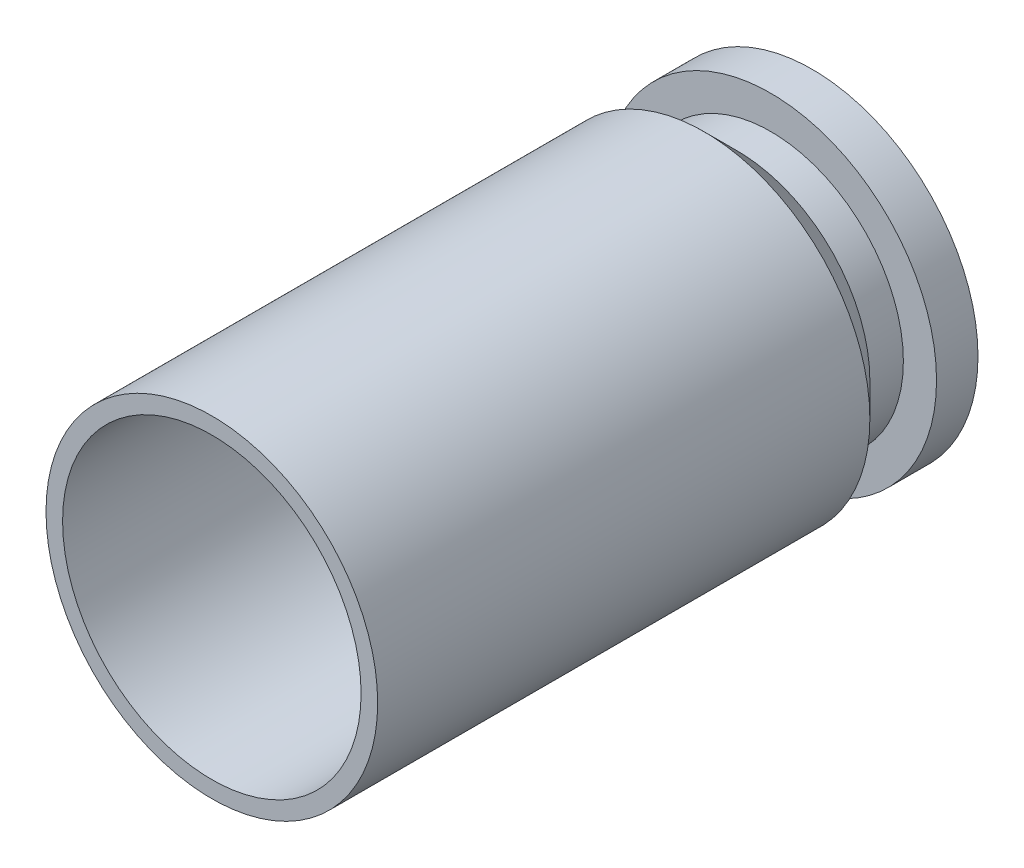
ISO-10303-21;
HEADER;
FILE_DESCRIPTION(('STEP AP214'),'2;1');
FILE_NAME('part.step','',(''),(''),'','','');
FILE_SCHEMA(('AUTOMOTIVE_DESIGN { 1 0 10303 214 1 1 1 1 }'));
ENDSEC;
DATA;
#1=APPLICATION_CONTEXT('core data for automotive mechanical design processes');
#2=APPLICATION_PROTOCOL_DEFINITION('international standard','automotive_design',2000,#1);
#3=PRODUCT_CONTEXT('',#1,'mechanical');
#4=PRODUCT('Part','Part','',(#3));
#5=PRODUCT_RELATED_PRODUCT_CATEGORY('part','',(#4));
#6=PRODUCT_DEFINITION_FORMATION('','',#4);
#7=PRODUCT_DEFINITION_CONTEXT('part definition',#1,'design');
#8=PRODUCT_DEFINITION('design','',#6,#7);
#9=PRODUCT_DEFINITION_SHAPE('','',#8);
#10=(LENGTH_UNIT() NAMED_UNIT(*) SI_UNIT(.MILLI.,.METRE.));
#11=(NAMED_UNIT(*) PLANE_ANGLE_UNIT() SI_UNIT($,.RADIAN.));
#12=(NAMED_UNIT(*) SI_UNIT($,.STERADIAN.) SOLID_ANGLE_UNIT());
#13=UNCERTAINTY_MEASURE_WITH_UNIT(LENGTH_MEASURE(1.E-05),#10,'distance_accuracy_value','');
#14=(GEOMETRIC_REPRESENTATION_CONTEXT(3) GLOBAL_UNCERTAINTY_ASSIGNED_CONTEXT((#13)) GLOBAL_UNIT_ASSIGNED_CONTEXT((#10,
#11,#12)) REPRESENTATION_CONTEXT('',''));
#15=CARTESIAN_POINT('',(0.,0.,0.));
#16=DIRECTION('',(0.,0.,1.));
#17=DIRECTION('',(1.,0.,0.));
#18=AXIS2_PLACEMENT_3D('',#15,#16,#17);
#19=CARTESIAN_POINT('',(0.,0.,0.));
#20=DIRECTION('',(0.,0.,1.));
#21=DIRECTION('',(1.,0.,0.));
#22=AXIS2_PLACEMENT_3D('',#19,#20,#21);
#23=PLANE('',#22);
#24=CARTESIAN_POINT('',(0.,0.,0.));
#25=DIRECTION('',(0.,0.,1.));
#26=DIRECTION('',(1.,0.,0.));
#27=AXIS2_PLACEMENT_3D('',#24,#25,#26);
#28=CIRCLE('',#27,4.5);
#29=CARTESIAN_POINT('',(4.5,0.,0.));
#30=VERTEX_POINT('',#29);
#31=EDGE_CURVE('E60',#30,#30,#28,.T.);
#32=ORIENTED_EDGE('',*,*,#31,.F.);
#33=EDGE_LOOP('',(#32));
#34=FACE_BOUND('',#33,.T.);
#35=CARTESIAN_POINT('',(0.,0.,0.));
#36=DIRECTION('',(0.,0.,1.));
#37=DIRECTION('',(1.,0.,0.));
#38=AXIS2_PLACEMENT_3D('',#35,#36,#37);
#39=CIRCLE('',#38,5.);
#40=CARTESIAN_POINT('',(5.,0.,0.));
#41=VERTEX_POINT('',#40);
#42=EDGE_CURVE('E44',#41,#41,#39,.T.);
#43=ORIENTED_EDGE('',*,*,#42,.T.);
#44=EDGE_LOOP('',(#43));
#45=FACE_BOUND('',#44,.T.);
#46=ADVANCED_FACE('F32',(#34,#45),#23,.T.);
#47=CARTESIAN_POINT('',(0.,0.,0.));
#48=DIRECTION('',(0.,0.,1.));
#49=DIRECTION('',(1.,0.,0.));
#50=AXIS2_PLACEMENT_3D('',#47,#48,#49);
#51=CYLINDRICAL_SURFACE('',#50,5.);
#52=CARTESIAN_POINT('',(0.,0.,-14.84));
#53=DIRECTION('',(0.,0.,-1.));
#54=DIRECTION('',(-1.,0.,0.));
#55=AXIS2_PLACEMENT_3D('',#52,#53,#54);
#56=CIRCLE('',#55,5.);
#57=CARTESIAN_POINT('',(-5.,0.,-14.84));
#58=VERTEX_POINT('',#57);
#59=EDGE_CURVE('E40',#58,#58,#56,.F.);
#60=ORIENTED_EDGE('',*,*,#59,.T.);
#61=EDGE_LOOP('',(#60));
#62=FACE_BOUND('',#61,.T.);
#63=ORIENTED_EDGE('',*,*,#42,.F.);
#64=EDGE_LOOP('',(#63));
#65=FACE_BOUND('',#64,.T.);
#66=ADVANCED_FACE('F77',(#62,#65),#51,.T.);
#67=CARTESIAN_POINT('',(0.,0.,0.));
#68=DIRECTION('',(0.,0.,1.));
#69=DIRECTION('',(1.,0.,0.));
#70=AXIS2_PLACEMENT_3D('',#67,#68,#69);
#71=CYLINDRICAL_SURFACE('',#70,4.);
#72=CARTESIAN_POINT('',(0.,0.,-15.84));
#73=DIRECTION('',(0.,0.,1.));
#74=DIRECTION('',(1.,0.,0.));
#75=AXIS2_PLACEMENT_3D('',#72,#73,#74);
#76=CIRCLE('',#75,4.);
#77=CARTESIAN_POINT('',(4.,0.,-15.84));
#78=VERTEX_POINT('',#77);
#79=EDGE_CURVE('E10',#78,#78,#76,.F.);
#80=ORIENTED_EDGE('',*,*,#79,.T.);
#81=EDGE_LOOP('',(#80));
#82=FACE_BOUND('',#81,.T.);
#83=CARTESIAN_POINT('',(0.,0.,-16.85));
#84=DIRECTION('',(0.,0.,1.));
#85=DIRECTION('',(1.,0.,0.));
#86=AXIS2_PLACEMENT_3D('',#83,#84,#85);
#87=CIRCLE('',#86,4.);
#88=CARTESIAN_POINT('',(4.,0.,-16.85));
#89=VERTEX_POINT('',#88);
#90=EDGE_CURVE('E48',#89,#89,#87,.T.);
#91=ORIENTED_EDGE('',*,*,#90,.T.);
#92=EDGE_LOOP('',(#91));
#93=FACE_BOUND('',#92,.T.);
#94=ADVANCED_FACE('F81',(#82,#93),#71,.T.);
#95=CARTESIAN_POINT('',(0.,-5.,-16.85));
#96=DIRECTION('',(0.,0.,1.));
#97=DIRECTION('',(1.,0.,0.));
#98=AXIS2_PLACEMENT_3D('',#95,#96,#97);
#99=PLANE('',#98);
#100=CARTESIAN_POINT('',(0.,0.,-16.85));
#101=DIRECTION('',(0.,0.,1.));
#102=DIRECTION('',(1.,0.,0.));
#103=AXIS2_PLACEMENT_3D('',#100,#101,#102);
#104=CIRCLE('',#103,5.);
#105=CARTESIAN_POINT('',(5.,0.,-16.85));
#106=VERTEX_POINT('',#105);
#107=EDGE_CURVE('E53',#106,#106,#104,.T.);
#108=ORIENTED_EDGE('',*,*,#107,.T.);
#109=EDGE_LOOP('',(#108));
#110=FACE_BOUND('',#109,.T.);
#111=ORIENTED_EDGE('',*,*,#90,.F.);
#112=EDGE_LOOP('',(#111));
#113=FACE_BOUND('',#112,.T.);
#114=ADVANCED_FACE('F86',(#110,#113),#99,.T.);
#115=CARTESIAN_POINT('',(0.,0.,0.));
#116=DIRECTION('',(0.,0.,1.));
#117=DIRECTION('',(1.,0.,0.));
#118=AXIS2_PLACEMENT_3D('',#115,#116,#117);
#119=CYLINDRICAL_SURFACE('',#118,5.);
#120=CARTESIAN_POINT('',(0.,0.,-18.1));
#121=DIRECTION('',(0.,0.,1.));
#122=DIRECTION('',(1.,0.,0.));
#123=AXIS2_PLACEMENT_3D('',#120,#121,#122);
#124=CIRCLE('',#123,5.);
#125=CARTESIAN_POINT('',(5.,0.,-18.1));
#126=VERTEX_POINT('',#125);
#127=EDGE_CURVE('E56',#126,#126,#124,.T.);
#128=ORIENTED_EDGE('',*,*,#127,.T.);
#129=EDGE_LOOP('',(#128));
#130=FACE_BOUND('',#129,.T.);
#131=ORIENTED_EDGE('',*,*,#107,.F.);
#132=EDGE_LOOP('',(#131));
#133=FACE_BOUND('',#132,.T.);
#134=ADVANCED_FACE('F91',(#130,#133),#119,.T.);
#135=CARTESIAN_POINT('',(0.,0.,-18.1));
#136=DIRECTION('',(0.,0.,-1.));
#137=DIRECTION('',(-1.,0.,0.));
#138=AXIS2_PLACEMENT_3D('',#135,#136,#137);
#139=PLANE('',#138);
#140=ORIENTED_EDGE('',*,*,#127,.F.);
#141=EDGE_LOOP('',(#140));
#142=FACE_BOUND('',#141,.T.);
#143=ADVANCED_FACE('F71',(#142),#139,.T.);
#144=CARTESIAN_POINT('',(0.,0.,-11.));
#145=DIRECTION('',(0.,0.,1.));
#146=DIRECTION('',(1.,0.,0.));
#147=AXIS2_PLACEMENT_3D('',#144,#145,#146);
#148=CYLINDRICAL_SURFACE('',#147,4.5);
#149=CARTESIAN_POINT('',(0.,0.,-11.));
#150=DIRECTION('',(0.,0.,1.));
#151=DIRECTION('',(1.,0.,0.));
#152=AXIS2_PLACEMENT_3D('',#149,#150,#151);
#153=CIRCLE('',#152,4.5);
#154=CARTESIAN_POINT('',(4.5,0.,-11.));
#155=VERTEX_POINT('',#154);
#156=EDGE_CURVE('E59',#155,#155,#153,.T.);
#157=ORIENTED_EDGE('',*,*,#156,.F.);
#158=EDGE_LOOP('',(#157));
#159=FACE_BOUND('',#158,.T.);
#160=ORIENTED_EDGE('',*,*,#31,.T.);
#161=EDGE_LOOP('',(#160));
#162=FACE_BOUND('',#161,.T.);
#163=ADVANCED_FACE('F68',(#159,#162),#148,.F.);
#164=CARTESIAN_POINT('',(0.,0.,-11.));
#165=DIRECTION('',(0.,0.,1.));
#166=DIRECTION('',(1.,0.,0.));
#167=AXIS2_PLACEMENT_3D('',#164,#165,#166);
#168=PLANE('',#167);
#169=ORIENTED_EDGE('',*,*,#156,.T.);
#170=EDGE_LOOP('',(#169));
#171=FACE_BOUND('',#170,.T.);
#172=ADVANCED_FACE('F66',(#171),#168,.T.);
#173=CARTESIAN_POINT('',(0.,0.,-14.84));
#174=DIRECTION('',(0.,0.,1.));
#175=DIRECTION('',(1.,0.,0.));
#176=AXIS2_PLACEMENT_3D('',#173,#174,#175);
#177=CONICAL_SURFACE('',#176,5.,0.785398163397443);
#178=ORIENTED_EDGE('',*,*,#79,.F.);
#179=EDGE_LOOP('',(#178));
#180=FACE_BOUND('',#179,.T.);
#181=ORIENTED_EDGE('',*,*,#59,.F.);
#182=EDGE_LOOP('',(#181));
#183=FACE_BOUND('',#182,.T.);
#184=ADVANCED_FACE('F35',(#180,#183),#177,.T.);
#185=CLOSED_SHELL('',(#46,#66,#94,#114,#134,#143,#163,#172,#184));
#186=MANIFOLD_SOLID_BREP('B2',#185);
#187=ADVANCED_BREP_SHAPE_REPRESENTATION('',(#18,#186),#14);
#188=SHAPE_DEFINITION_REPRESENTATION(#9,#187);
ENDSEC;
END-ISO-10303-21;
